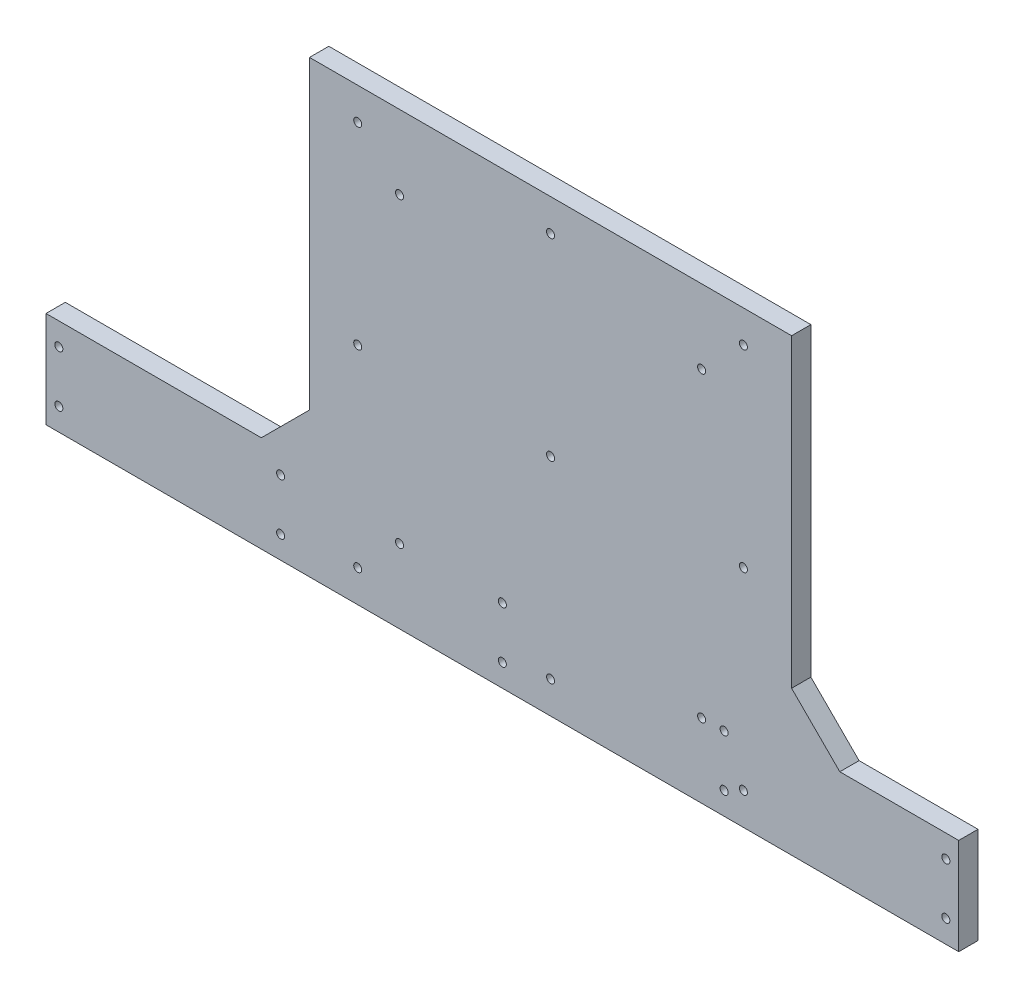
ISO-10303-21;
HEADER;
FILE_DESCRIPTION(('STEP AP214'),'2;1');
FILE_NAME('part.step','',(''),(''),'','','');
FILE_SCHEMA(('AUTOMOTIVE_DESIGN { 1 0 10303 214 1 1 1 1 }'));
ENDSEC;
DATA;
#1=APPLICATION_CONTEXT('core data for automotive mechanical design processes');
#2=APPLICATION_PROTOCOL_DEFINITION('international standard','automotive_design',2000,#1);
#3=PRODUCT_CONTEXT('',#1,'mechanical');
#4=PRODUCT('Part','Part','',(#3));
#5=PRODUCT_RELATED_PRODUCT_CATEGORY('part','',(#4));
#6=PRODUCT_DEFINITION_FORMATION('','',#4);
#7=PRODUCT_DEFINITION_CONTEXT('part definition',#1,'design');
#8=PRODUCT_DEFINITION('design','',#6,#7);
#9=PRODUCT_DEFINITION_SHAPE('','',#8);
#10=(LENGTH_UNIT() NAMED_UNIT(*) SI_UNIT(.MILLI.,.METRE.));
#11=(NAMED_UNIT(*) PLANE_ANGLE_UNIT() SI_UNIT($,.RADIAN.));
#12=(NAMED_UNIT(*) SI_UNIT($,.STERADIAN.) SOLID_ANGLE_UNIT());
#13=UNCERTAINTY_MEASURE_WITH_UNIT(LENGTH_MEASURE(1.E-05),#10,'distance_accuracy_value','');
#14=(GEOMETRIC_REPRESENTATION_CONTEXT(3) GLOBAL_UNCERTAINTY_ASSIGNED_CONTEXT((#13)) GLOBAL_UNIT_ASSIGNED_CONTEXT((#10,
#11,#12)) REPRESENTATION_CONTEXT('',''));
#15=CARTESIAN_POINT('',(0.,0.,0.));
#16=DIRECTION('',(0.,0.,1.));
#17=DIRECTION('',(1.,0.,0.));
#18=AXIS2_PLACEMENT_3D('',#15,#16,#17);
#19=CARTESIAN_POINT('',(150.,0.,6.));
#20=DIRECTION('',(-1.,0.,0.));
#21=DIRECTION('',(0.,0.,1.));
#22=AXIS2_PLACEMENT_3D('',#19,#20,#21);
#23=PLANE('',#22);
#24=DIRECTION('',(0.,1.,0.));
#25=VECTOR('',#24,1.);
#26=CARTESIAN_POINT('',(150.,0.,6.));
#27=LINE('',#26,#25);
#28=CARTESIAN_POINT('',(150.,45.,6.));
#29=VERTEX_POINT('',#28);
#30=CARTESIAN_POINT('',(150.,140.,6.));
#31=VERTEX_POINT('',#30);
#32=EDGE_CURVE('E243',#29,#31,#27,.T.);
#33=ORIENTED_EDGE('',*,*,#32,.F.);
#34=DIRECTION('',(0.,0.,-1.));
#35=VECTOR('',#34,1.);
#36=CARTESIAN_POINT('',(150.,45.,6.));
#37=LINE('',#36,#35);
#38=CARTESIAN_POINT('',(150.,45.,0.));
#39=VERTEX_POINT('',#38);
#40=EDGE_CURVE('E54',#29,#39,#37,.T.);
#41=ORIENTED_EDGE('',*,*,#40,.T.);
#42=DIRECTION('',(0.,1.,0.));
#43=VECTOR('',#42,1.);
#44=CARTESIAN_POINT('',(150.,0.,0.));
#45=LINE('',#44,#43);
#46=CARTESIAN_POINT('',(150.,140.,0.));
#47=VERTEX_POINT('',#46);
#48=EDGE_CURVE('E119',#39,#47,#45,.T.);
#49=ORIENTED_EDGE('',*,*,#48,.T.);
#50=DIRECTION('',(0.,0.,-1.));
#51=VECTOR('',#50,1.);
#52=CARTESIAN_POINT('',(150.,140.,6.));
#53=LINE('',#52,#51);
#54=EDGE_CURVE('E254',#31,#47,#53,.T.);
#55=ORIENTED_EDGE('',*,*,#54,.F.);
#56=EDGE_LOOP('',(#33,#41,#49,#55));
#57=FACE_BOUND('',#56,.T.);
#58=ADVANCED_FACE('F33',(#57),#23,.F.);
#59=CARTESIAN_POINT('',(0.,0.,6.));
#60=DIRECTION('',(1.,0.,0.));
#61=DIRECTION('',(0.,0.,-1.));
#62=AXIS2_PLACEMENT_3D('',#59,#60,#61);
#63=PLANE('',#62);
#64=DIRECTION('',(0.,-1.,0.));
#65=VECTOR('',#64,1.);
#66=CARTESIAN_POINT('',(0.,0.,0.));
#67=LINE('',#66,#65);
#68=CARTESIAN_POINT('',(0.,140.,0.));
#69=VERTEX_POINT('',#68);
#70=CARTESIAN_POINT('',(0.,45.0000000000001,0.));
#71=VERTEX_POINT('',#70);
#72=EDGE_CURVE('E120',#69,#71,#67,.T.);
#73=ORIENTED_EDGE('',*,*,#72,.T.);
#74=DIRECTION('',(0.,0.,1.));
#75=VECTOR('',#74,1.);
#76=CARTESIAN_POINT('',(0.,45.0000000000001,6.));
#77=LINE('',#76,#75);
#78=CARTESIAN_POINT('',(0.,45.0000000000001,6.));
#79=VERTEX_POINT('',#78);
#80=EDGE_CURVE('E257',#71,#79,#77,.T.);
#81=ORIENTED_EDGE('',*,*,#80,.T.);
#82=DIRECTION('',(0.,-1.,0.));
#83=VECTOR('',#82,1.);
#84=CARTESIAN_POINT('',(0.,0.,6.));
#85=LINE('',#84,#83);
#86=CARTESIAN_POINT('',(0.,140.,6.));
#87=VERTEX_POINT('',#86);
#88=EDGE_CURVE('E237',#87,#79,#85,.T.);
#89=ORIENTED_EDGE('',*,*,#88,.F.);
#90=DIRECTION('',(0.,0.,-1.));
#91=VECTOR('',#90,1.);
#92=CARTESIAN_POINT('',(0.,140.,6.));
#93=LINE('',#92,#91);
#94=EDGE_CURVE('E247',#87,#69,#93,.T.);
#95=ORIENTED_EDGE('',*,*,#94,.T.);
#96=EDGE_LOOP('',(#73,#81,#89,#95));
#97=FACE_BOUND('',#96,.T.);
#98=ADVANCED_FACE('F276',(#97),#63,.F.);
#99=CARTESIAN_POINT('',(0.,0.,6.));
#100=DIRECTION('',(0.,1.,0.));
#101=DIRECTION('',(0.,0.,1.));
#102=AXIS2_PLACEMENT_3D('',#99,#100,#101);
#103=PLANE('',#102);
#104=DIRECTION('',(1.,0.,0.));
#105=VECTOR('',#104,1.);
#106=CARTESIAN_POINT('',(0.,0.,0.));
#107=LINE('',#106,#105);
#108=CARTESIAN_POINT('',(-82.,0.,0.));
#109=VERTEX_POINT('',#108);
#110=CARTESIAN_POINT('',(202.,0.,0.));
#111=VERTEX_POINT('',#110);
#112=EDGE_CURVE('E108',#109,#111,#107,.T.);
#113=ORIENTED_EDGE('',*,*,#112,.T.);
#114=DIRECTION('',(0.,0.,1.));
#115=VECTOR('',#114,1.);
#116=CARTESIAN_POINT('',(202.,0.,0.));
#117=LINE('',#116,#115);
#118=CARTESIAN_POINT('',(202.,0.,6.));
#119=VERTEX_POINT('',#118);
#120=EDGE_CURVE('E111',#111,#119,#117,.T.);
#121=ORIENTED_EDGE('',*,*,#120,.T.);
#122=DIRECTION('',(1.,0.,0.));
#123=VECTOR('',#122,1.);
#124=CARTESIAN_POINT('',(0.,0.,6.));
#125=LINE('',#124,#123);
#126=CARTESIAN_POINT('',(-82.,0.,6.));
#127=VERTEX_POINT('',#126);
#128=EDGE_CURVE('E240',#127,#119,#125,.T.);
#129=ORIENTED_EDGE('',*,*,#128,.F.);
#130=DIRECTION('',(0.,0.,1.));
#131=VECTOR('',#130,1.);
#132=CARTESIAN_POINT('',(-82.,0.,0.));
#133=LINE('',#132,#131);
#134=EDGE_CURVE('E114',#109,#127,#133,.T.);
#135=ORIENTED_EDGE('',*,*,#134,.F.);
#136=EDGE_LOOP('',(#113,#121,#129,#135));
#137=FACE_BOUND('',#136,.T.);
#138=ADVANCED_FACE('F110',(#137),#103,.F.);
#139=CARTESIAN_POINT('',(0.,140.,6.));
#140=DIRECTION('',(0.,-1.,0.));
#141=DIRECTION('',(0.,0.,-1.));
#142=AXIS2_PLACEMENT_3D('',#139,#140,#141);
#143=PLANE('',#142);
#144=DIRECTION('',(-1.,0.,0.));
#145=VECTOR('',#144,1.);
#146=CARTESIAN_POINT('',(0.,140.,0.));
#147=LINE('',#146,#145);
#148=EDGE_CURVE('E241',#47,#69,#147,.T.);
#149=ORIENTED_EDGE('',*,*,#148,.T.);
#150=ORIENTED_EDGE('',*,*,#94,.F.);
#151=DIRECTION('',(-1.,0.,0.));
#152=VECTOR('',#151,1.);
#153=CARTESIAN_POINT('',(0.,140.,6.));
#154=LINE('',#153,#152);
#155=EDGE_CURVE('E245',#31,#87,#154,.T.);
#156=ORIENTED_EDGE('',*,*,#155,.F.);
#157=ORIENTED_EDGE('',*,*,#54,.T.);
#158=EDGE_LOOP('',(#149,#150,#156,#157));
#159=FACE_BOUND('',#158,.T.);
#160=ADVANCED_FACE('F297',(#159),#143,.F.);
#161=CARTESIAN_POINT('',(0.,0.,6.));
#162=DIRECTION('',(0.,0.,-1.));
#163=DIRECTION('',(-1.,0.,0.));
#164=AXIS2_PLACEMENT_3D('',#161,#162,#163);
#165=PLANE('',#164);
#166=CARTESIAN_POINT('',(60.,23.,6.));
#167=DIRECTION('',(0.,0.,1.));
#168=DIRECTION('',(-1.,0.,0.));
#169=AXIS2_PLACEMENT_3D('',#166,#167,#168);
#170=CIRCLE('',#169,1.25000000000002);
#171=CARTESIAN_POINT('',(58.75,23.,6.));
#172=VERTEX_POINT('',#171);
#173=EDGE_CURVE('E543',#172,#172,#170,.T.);
#174=ORIENTED_EDGE('',*,*,#173,.F.);
#175=EDGE_LOOP('',(#174));
#176=FACE_BOUND('',#175,.T.);
#177=CARTESIAN_POINT('',(-9.00000000000002,23.,6.));
#178=DIRECTION('',(0.,0.,1.));
#179=DIRECTION('',(1.,0.,0.));
#180=AXIS2_PLACEMENT_3D('',#177,#178,#179);
#181=CIRCLE('',#180,1.25000000000002);
#182=CARTESIAN_POINT('',(-7.75,23.,6.));
#183=VERTEX_POINT('',#182);
#184=EDGE_CURVE('E539',#183,#183,#181,.T.);
#185=ORIENTED_EDGE('',*,*,#184,.F.);
#186=EDGE_LOOP('',(#185));
#187=FACE_BOUND('',#186,.T.);
#188=CARTESIAN_POINT('',(-9.00000000000002,7.,6.));
#189=DIRECTION('',(0.,0.,1.));
#190=DIRECTION('',(-1.,0.,0.));
#191=AXIS2_PLACEMENT_3D('',#188,#189,#190);
#192=CIRCLE('',#191,1.24999999999998);
#193=CARTESIAN_POINT('',(-10.25,7.,6.));
#194=VERTEX_POINT('',#193);
#195=EDGE_CURVE('E555',#194,#194,#192,.T.);
#196=ORIENTED_EDGE('',*,*,#195,.F.);
#197=EDGE_LOOP('',(#196));
#198=FACE_BOUND('',#197,.T.);
#199=CARTESIAN_POINT('',(129.,7.00000000000002,6.));
#200=DIRECTION('',(0.,0.,1.));
#201=DIRECTION('',(1.,0.,0.));
#202=AXIS2_PLACEMENT_3D('',#199,#200,#201);
#203=CIRCLE('',#202,1.25000000000001);
#204=CARTESIAN_POINT('',(130.25,7.00000000000002,6.));
#205=VERTEX_POINT('',#204);
#206=EDGE_CURVE('E551',#205,#205,#203,.T.);
#207=ORIENTED_EDGE('',*,*,#206,.F.);
#208=EDGE_LOOP('',(#207));
#209=FACE_BOUND('',#208,.T.);
#210=CARTESIAN_POINT('',(129.,23.,6.));
#211=DIRECTION('',(0.,0.,1.));
#212=DIRECTION('',(-1.,0.,0.));
#213=AXIS2_PLACEMENT_3D('',#210,#211,#212);
#214=CIRCLE('',#213,1.25000000000004);
#215=CARTESIAN_POINT('',(127.75,23.,6.));
#216=VERTEX_POINT('',#215);
#217=EDGE_CURVE('E547',#216,#216,#214,.T.);
#218=ORIENTED_EDGE('',*,*,#217,.F.);
#219=EDGE_LOOP('',(#218));
#220=FACE_BOUND('',#219,.T.);
#221=CARTESIAN_POINT('',(-78.,6.99999999999999,6.));
#222=DIRECTION('',(0.,0.,1.));
#223=DIRECTION('',(-1.,0.,0.));
#224=AXIS2_PLACEMENT_3D('',#221,#222,#223);
#225=CIRCLE('',#224,1.24999999999998);
#226=CARTESIAN_POINT('',(-79.25,6.99999999999999,6.));
#227=VERTEX_POINT('',#226);
#228=EDGE_CURVE('E527',#227,#227,#225,.T.);
#229=ORIENTED_EDGE('',*,*,#228,.F.);
#230=EDGE_LOOP('',(#229));
#231=FACE_BOUND('',#230,.T.);
#232=CARTESIAN_POINT('',(198.,6.99999999999999,6.));
#233=DIRECTION('',(0.,0.,1.));
#234=DIRECTION('',(1.,0.,0.));
#235=AXIS2_PLACEMENT_3D('',#232,#233,#234);
#236=CIRCLE('',#235,1.24999999999996);
#237=CARTESIAN_POINT('',(199.25,6.99999999999999,6.));
#238=VERTEX_POINT('',#237);
#239=EDGE_CURVE('E523',#238,#238,#236,.T.);
#240=ORIENTED_EDGE('',*,*,#239,.F.);
#241=EDGE_LOOP('',(#240));
#242=FACE_BOUND('',#241,.T.);
#243=CARTESIAN_POINT('',(198.,23.,6.));
#244=DIRECTION('',(0.,0.,1.));
#245=DIRECTION('',(-1.,0.,0.));
#246=AXIS2_PLACEMENT_3D('',#243,#244,#245);
#247=CIRCLE('',#246,1.24999999999996);
#248=CARTESIAN_POINT('',(196.75,23.,6.));
#249=VERTEX_POINT('',#248);
#250=EDGE_CURVE('E535',#249,#249,#247,.T.);
#251=ORIENTED_EDGE('',*,*,#250,.F.);
#252=EDGE_LOOP('',(#251));
#253=FACE_BOUND('',#252,.T.);
#254=CARTESIAN_POINT('',(60.,7.,6.));
#255=DIRECTION('',(0.,0.,1.));
#256=DIRECTION('',(1.,0.,0.));
#257=AXIS2_PLACEMENT_3D('',#254,#255,#256);
#258=CIRCLE('',#257,1.24999999999998);
#259=CARTESIAN_POINT('',(61.25,7.,6.));
#260=VERTEX_POINT('',#259);
#261=EDGE_CURVE('E531',#260,#260,#258,.T.);
#262=ORIENTED_EDGE('',*,*,#261,.F.);
#263=EDGE_LOOP('',(#262));
#264=FACE_BOUND('',#263,.T.);
#265=CARTESIAN_POINT('',(-78.,23.,6.));
#266=DIRECTION('',(0.,0.,1.));
#267=DIRECTION('',(1.,0.,0.));
#268=AXIS2_PLACEMENT_3D('',#265,#266,#267);
#269=CIRCLE('',#268,1.25);
#270=CARTESIAN_POINT('',(-76.75,23.,6.));
#271=VERTEX_POINT('',#270);
#272=EDGE_CURVE('E140',#271,#271,#269,.T.);
#273=ORIENTED_EDGE('',*,*,#272,.F.);
#274=EDGE_LOOP('',(#273));
#275=FACE_BOUND('',#274,.T.);
#276=CARTESIAN_POINT('',(75.,70.,6.));
#277=DIRECTION('',(0.,0.,1.));
#278=DIRECTION('',(-1.,0.,0.));
#279=AXIS2_PLACEMENT_3D('',#276,#277,#278);
#280=CIRCLE('',#279,1.25);
#281=CARTESIAN_POINT('',(73.75,70.,6.));
#282=VERTEX_POINT('',#281);
#283=EDGE_CURVE('E176',#282,#282,#280,.T.);
#284=ORIENTED_EDGE('',*,*,#283,.F.);
#285=EDGE_LOOP('',(#284));
#286=FACE_BOUND('',#285,.T.);
#287=CARTESIAN_POINT('',(135.,130.,6.));
#288=DIRECTION('',(0.,0.,1.));
#289=DIRECTION('',(1.,0.,0.));
#290=AXIS2_PLACEMENT_3D('',#287,#288,#289);
#291=CIRCLE('',#290,1.25000000000001);
#292=CARTESIAN_POINT('',(136.25,130.,6.));
#293=VERTEX_POINT('',#292);
#294=EDGE_CURVE('E163',#293,#293,#291,.T.);
#295=ORIENTED_EDGE('',*,*,#294,.F.);
#296=EDGE_LOOP('',(#295));
#297=FACE_BOUND('',#296,.T.);
#298=CARTESIAN_POINT('',(15.,130.,6.));
#299=DIRECTION('',(0.,0.,1.));
#300=DIRECTION('',(-1.,0.,0.));
#301=AXIS2_PLACEMENT_3D('',#298,#299,#300);
#302=CIRCLE('',#301,1.25);
#303=CARTESIAN_POINT('',(13.75,130.,6.));
#304=VERTEX_POINT('',#303);
#305=EDGE_CURVE('E164',#304,#304,#302,.T.);
#306=ORIENTED_EDGE('',*,*,#305,.F.);
#307=EDGE_LOOP('',(#306));
#308=FACE_BOUND('',#307,.T.);
#309=CARTESIAN_POINT('',(75.,130.,6.));
#310=DIRECTION('',(0.,0.,1.));
#311=DIRECTION('',(-1.,0.,0.));
#312=AXIS2_PLACEMENT_3D('',#309,#310,#311);
#313=CIRCLE('',#312,1.25);
#314=CARTESIAN_POINT('',(73.75,130.,6.));
#315=VERTEX_POINT('',#314);
#316=EDGE_CURVE('E157',#315,#315,#313,.T.);
#317=ORIENTED_EDGE('',*,*,#316,.F.);
#318=EDGE_LOOP('',(#317));
#319=FACE_BOUND('',#318,.T.);
#320=CARTESIAN_POINT('',(15.,70.,6.));
#321=DIRECTION('',(0.,0.,1.));
#322=DIRECTION('',(-1.,0.,0.));
#323=AXIS2_PLACEMENT_3D('',#320,#321,#322);
#324=CIRCLE('',#323,1.25);
#325=CARTESIAN_POINT('',(13.75,70.,6.));
#326=VERTEX_POINT('',#325);
#327=EDGE_CURVE('E175',#326,#326,#324,.T.);
#328=ORIENTED_EDGE('',*,*,#327,.F.);
#329=EDGE_LOOP('',(#328));
#330=FACE_BOUND('',#329,.T.);
#331=CARTESIAN_POINT('',(135.,70.,6.));
#332=DIRECTION('',(0.,0.,1.));
#333=DIRECTION('',(1.,0.,0.));
#334=AXIS2_PLACEMENT_3D('',#331,#332,#333);
#335=CIRCLE('',#334,1.25000000000001);
#336=CARTESIAN_POINT('',(136.25,70.,6.));
#337=VERTEX_POINT('',#336);
#338=EDGE_CURVE('E200',#337,#337,#335,.T.);
#339=ORIENTED_EDGE('',*,*,#338,.F.);
#340=EDGE_LOOP('',(#339));
#341=FACE_BOUND('',#340,.T.);
#342=CARTESIAN_POINT('',(135.,10.,6.));
#343=DIRECTION('',(0.,0.,1.));
#344=DIRECTION('',(-1.,0.,0.));
#345=AXIS2_PLACEMENT_3D('',#342,#343,#344);
#346=CIRCLE('',#345,1.25000000000001);
#347=CARTESIAN_POINT('',(133.75,10.,6.));
#348=VERTEX_POINT('',#347);
#349=EDGE_CURVE('E194',#348,#348,#346,.T.);
#350=ORIENTED_EDGE('',*,*,#349,.F.);
#351=EDGE_LOOP('',(#350));
#352=FACE_BOUND('',#351,.T.);
#353=CARTESIAN_POINT('',(15.,10.,6.));
#354=DIRECTION('',(0.,0.,1.));
#355=DIRECTION('',(1.,0.,0.));
#356=AXIS2_PLACEMENT_3D('',#353,#354,#355);
#357=CIRCLE('',#356,1.25);
#358=CARTESIAN_POINT('',(16.25,10.,6.));
#359=VERTEX_POINT('',#358);
#360=EDGE_CURVE('E188',#359,#359,#357,.T.);
#361=ORIENTED_EDGE('',*,*,#360,.F.);
#362=EDGE_LOOP('',(#361));
#363=FACE_BOUND('',#362,.T.);
#364=CARTESIAN_POINT('',(75.,10.,6.));
#365=DIRECTION('',(0.,0.,1.));
#366=DIRECTION('',(1.,0.,0.));
#367=AXIS2_PLACEMENT_3D('',#364,#365,#366);
#368=CIRCLE('',#367,1.25);
#369=CARTESIAN_POINT('',(76.25,10.,6.));
#370=VERTEX_POINT('',#369);
#371=EDGE_CURVE('E187',#370,#370,#368,.T.);
#372=ORIENTED_EDGE('',*,*,#371,.F.);
#373=EDGE_LOOP('',(#372));
#374=FACE_BOUND('',#373,.T.);
#375=CARTESIAN_POINT('',(122.,117.,6.));
#376=DIRECTION('',(0.,0.,1.));
#377=DIRECTION('',(-1.,0.,0.));
#378=AXIS2_PLACEMENT_3D('',#375,#376,#377);
#379=CIRCLE('',#378,1.25);
#380=CARTESIAN_POINT('',(120.75,117.,6.));
#381=VERTEX_POINT('',#380);
#382=EDGE_CURVE('E218',#381,#381,#379,.T.);
#383=ORIENTED_EDGE('',*,*,#382,.F.);
#384=EDGE_LOOP('',(#383));
#385=FACE_BOUND('',#384,.T.);
#386=CARTESIAN_POINT('',(122.,23.,6.));
#387=DIRECTION('',(0.,0.,1.));
#388=DIRECTION('',(1.,0.,0.));
#389=AXIS2_PLACEMENT_3D('',#386,#387,#388);
#390=CIRCLE('',#389,1.25);
#391=CARTESIAN_POINT('',(123.25,23.,6.));
#392=VERTEX_POINT('',#391);
#393=EDGE_CURVE('E224',#392,#392,#390,.T.);
#394=ORIENTED_EDGE('',*,*,#393,.F.);
#395=EDGE_LOOP('',(#394));
#396=FACE_BOUND('',#395,.T.);
#397=CARTESIAN_POINT('',(28.,23.,6.));
#398=DIRECTION('',(0.,0.,1.));
#399=DIRECTION('',(-1.,0.,0.));
#400=AXIS2_PLACEMENT_3D('',#397,#398,#399);
#401=CIRCLE('',#400,1.25);
#402=CARTESIAN_POINT('',(26.75,23.,6.));
#403=VERTEX_POINT('',#402);
#404=EDGE_CURVE('E211',#403,#403,#401,.T.);
#405=ORIENTED_EDGE('',*,*,#404,.F.);
#406=EDGE_LOOP('',(#405));
#407=FACE_BOUND('',#406,.T.);
#408=CARTESIAN_POINT('',(28.,117.,6.));
#409=DIRECTION('',(0.,0.,1.));
#410=DIRECTION('',(1.,0.,0.));
#411=AXIS2_PLACEMENT_3D('',#408,#409,#410);
#412=CIRCLE('',#411,1.25);
#413=CARTESIAN_POINT('',(29.25,117.,6.));
#414=VERTEX_POINT('',#413);
#415=EDGE_CURVE('E217',#414,#414,#412,.T.);
#416=ORIENTED_EDGE('',*,*,#415,.F.);
#417=EDGE_LOOP('',(#416));
#418=FACE_BOUND('',#417,.T.);
#419=ORIENTED_EDGE('',*,*,#88,.T.);
#420=DIRECTION('',(-0.707106781186544,-0.707106781186551,0.));
#421=VECTOR('',#420,1.);
#422=CARTESIAN_POINT('',(-22.5,22.4999999999998,6.));
#423=LINE('',#422,#421);
#424=CARTESIAN_POINT('',(-15.,30.,6.));
#425=VERTEX_POINT('',#424);
#426=EDGE_CURVE('E266',#79,#425,#423,.T.);
#427=ORIENTED_EDGE('',*,*,#426,.T.);
#428=DIRECTION('',(-1.,0.,0.));
#429=VECTOR('',#428,1.);
#430=CARTESIAN_POINT('',(0.,30.,6.));
#431=LINE('',#430,#429);
#432=CARTESIAN_POINT('',(-82.,30.,6.));
#433=VERTEX_POINT('',#432);
#434=EDGE_CURVE('E145',#425,#433,#431,.T.);
#435=ORIENTED_EDGE('',*,*,#434,.T.);
#436=DIRECTION('',(0.,-1.,0.));
#437=VECTOR('',#436,1.);
#438=CARTESIAN_POINT('',(-82.,0.,6.));
#439=LINE('',#438,#437);
#440=EDGE_CURVE('E150',#433,#127,#439,.T.);
#441=ORIENTED_EDGE('',*,*,#440,.T.);
#442=ORIENTED_EDGE('',*,*,#128,.T.);
#443=DIRECTION('',(0.,1.,0.));
#444=VECTOR('',#443,1.);
#445=CARTESIAN_POINT('',(202.,0.,6.));
#446=LINE('',#445,#444);
#447=CARTESIAN_POINT('',(202.,30.,6.));
#448=VERTEX_POINT('',#447);
#449=EDGE_CURVE('E128',#119,#448,#446,.T.);
#450=ORIENTED_EDGE('',*,*,#449,.T.);
#451=DIRECTION('',(-1.,0.,0.));
#452=VECTOR('',#451,1.);
#453=CARTESIAN_POINT('',(150.,30.,6.));
#454=LINE('',#453,#452);
#455=CARTESIAN_POINT('',(165.,30.,6.));
#456=VERTEX_POINT('',#455);
#457=EDGE_CURVE('E135',#448,#456,#454,.T.);
#458=ORIENTED_EDGE('',*,*,#457,.T.);
#459=DIRECTION('',(-0.707106781186551,0.707106781186544,0.));
#460=VECTOR('',#459,1.);
#461=CARTESIAN_POINT('',(97.4999999999993,97.5000000000002,6.));
#462=LINE('',#461,#460);
#463=EDGE_CURVE('E41',#456,#29,#462,.T.);
#464=ORIENTED_EDGE('',*,*,#463,.T.);
#465=ORIENTED_EDGE('',*,*,#32,.T.);
#466=ORIENTED_EDGE('',*,*,#155,.T.);
#467=EDGE_LOOP('',(#419,#427,#435,#441,#442,#450,#458,#464,#465,#466));
#468=FACE_BOUND('',#467,.T.);
#469=ADVANCED_FACE('F281',(#176,#187,#198,#209,#220,#231,#242,#253,#264,#275,#286,#297,#308,
#319,#330,#341,#352,#363,#374,#385,#396,#407,#418,#468),#165,.F.);
#470=CARTESIAN_POINT('',(0.,0.,0.));
#471=DIRECTION('',(0.,0.,-1.));
#472=DIRECTION('',(-1.,0.,0.));
#473=AXIS2_PLACEMENT_3D('',#470,#471,#472);
#474=PLANE('',#473);
#475=CARTESIAN_POINT('',(60.,23.,0.));
#476=DIRECTION('',(0.,0.,1.));
#477=DIRECTION('',(-1.,0.,0.));
#478=AXIS2_PLACEMENT_3D('',#475,#476,#477);
#479=CIRCLE('',#478,1.25000000000002);
#480=CARTESIAN_POINT('',(58.75,23.,0.));
#481=VERTEX_POINT('',#480);
#482=EDGE_CURVE('E421',#481,#481,#479,.T.);
#483=ORIENTED_EDGE('',*,*,#482,.T.);
#484=EDGE_LOOP('',(#483));
#485=FACE_BOUND('',#484,.T.);
#486=CARTESIAN_POINT('',(-9.00000000000002,23.,0.));
#487=DIRECTION('',(0.,0.,1.));
#488=DIRECTION('',(1.,0.,0.));
#489=AXIS2_PLACEMENT_3D('',#486,#487,#488);
#490=CIRCLE('',#489,1.25000000000002);
#491=CARTESIAN_POINT('',(-7.75,23.,0.));
#492=VERTEX_POINT('',#491);
#493=EDGE_CURVE('E425',#492,#492,#490,.T.);
#494=ORIENTED_EDGE('',*,*,#493,.T.);
#495=EDGE_LOOP('',(#494));
#496=FACE_BOUND('',#495,.T.);
#497=CARTESIAN_POINT('',(-9.00000000000002,7.,0.));
#498=DIRECTION('',(0.,0.,1.));
#499=DIRECTION('',(-1.,0.,0.));
#500=AXIS2_PLACEMENT_3D('',#497,#498,#499);
#501=CIRCLE('',#500,1.24999999999998);
#502=CARTESIAN_POINT('',(-10.25,7.,0.));
#503=VERTEX_POINT('',#502);
#504=EDGE_CURVE('E429',#503,#503,#501,.T.);
#505=ORIENTED_EDGE('',*,*,#504,.T.);
#506=EDGE_LOOP('',(#505));
#507=FACE_BOUND('',#506,.T.);
#508=CARTESIAN_POINT('',(129.,7.00000000000002,0.));
#509=DIRECTION('',(0.,0.,1.));
#510=DIRECTION('',(1.,0.,0.));
#511=AXIS2_PLACEMENT_3D('',#508,#509,#510);
#512=CIRCLE('',#511,1.25000000000001);
#513=CARTESIAN_POINT('',(130.25,7.00000000000002,0.));
#514=VERTEX_POINT('',#513);
#515=EDGE_CURVE('E433',#514,#514,#512,.T.);
#516=ORIENTED_EDGE('',*,*,#515,.T.);
#517=EDGE_LOOP('',(#516));
#518=FACE_BOUND('',#517,.T.);
#519=CARTESIAN_POINT('',(129.,23.,0.));
#520=DIRECTION('',(0.,0.,1.));
#521=DIRECTION('',(-1.,0.,0.));
#522=AXIS2_PLACEMENT_3D('',#519,#520,#521);
#523=CIRCLE('',#522,1.25000000000004);
#524=CARTESIAN_POINT('',(127.75,23.,0.));
#525=VERTEX_POINT('',#524);
#526=EDGE_CURVE('E437',#525,#525,#523,.T.);
#527=ORIENTED_EDGE('',*,*,#526,.T.);
#528=EDGE_LOOP('',(#527));
#529=FACE_BOUND('',#528,.T.);
#530=CARTESIAN_POINT('',(-78.,6.99999999999999,0.));
#531=DIRECTION('',(0.,0.,1.));
#532=DIRECTION('',(-1.,0.,0.));
#533=AXIS2_PLACEMENT_3D('',#530,#531,#532);
#534=CIRCLE('',#533,1.24999999999998);
#535=CARTESIAN_POINT('',(-79.25,6.99999999999999,0.));
#536=VERTEX_POINT('',#535);
#537=EDGE_CURVE('E441',#536,#536,#534,.T.);
#538=ORIENTED_EDGE('',*,*,#537,.T.);
#539=EDGE_LOOP('',(#538));
#540=FACE_BOUND('',#539,.T.);
#541=CARTESIAN_POINT('',(198.,6.99999999999999,0.));
#542=DIRECTION('',(0.,0.,1.));
#543=DIRECTION('',(1.,0.,0.));
#544=AXIS2_PLACEMENT_3D('',#541,#542,#543);
#545=CIRCLE('',#544,1.24999999999996);
#546=CARTESIAN_POINT('',(199.25,6.99999999999999,0.));
#547=VERTEX_POINT('',#546);
#548=EDGE_CURVE('E445',#547,#547,#545,.T.);
#549=ORIENTED_EDGE('',*,*,#548,.T.);
#550=EDGE_LOOP('',(#549));
#551=FACE_BOUND('',#550,.T.);
#552=CARTESIAN_POINT('',(198.,23.,0.));
#553=DIRECTION('',(0.,0.,1.));
#554=DIRECTION('',(-1.,0.,0.));
#555=AXIS2_PLACEMENT_3D('',#552,#553,#554);
#556=CIRCLE('',#555,1.24999999999996);
#557=CARTESIAN_POINT('',(196.75,23.,0.));
#558=VERTEX_POINT('',#557);
#559=EDGE_CURVE('E449',#558,#558,#556,.T.);
#560=ORIENTED_EDGE('',*,*,#559,.T.);
#561=EDGE_LOOP('',(#560));
#562=FACE_BOUND('',#561,.T.);
#563=CARTESIAN_POINT('',(60.,7.,0.));
#564=DIRECTION('',(0.,0.,1.));
#565=DIRECTION('',(1.,0.,0.));
#566=AXIS2_PLACEMENT_3D('',#563,#564,#565);
#567=CIRCLE('',#566,1.24999999999998);
#568=CARTESIAN_POINT('',(61.25,7.,0.));
#569=VERTEX_POINT('',#568);
#570=EDGE_CURVE('E453',#569,#569,#567,.T.);
#571=ORIENTED_EDGE('',*,*,#570,.T.);
#572=EDGE_LOOP('',(#571));
#573=FACE_BOUND('',#572,.T.);
#574=CARTESIAN_POINT('',(-78.,23.,0.));
#575=DIRECTION('',(0.,0.,1.));
#576=DIRECTION('',(1.,0.,0.));
#577=AXIS2_PLACEMENT_3D('',#574,#575,#576);
#578=CIRCLE('',#577,1.25);
#579=CARTESIAN_POINT('',(-76.75,23.,0.));
#580=VERTEX_POINT('',#579);
#581=EDGE_CURVE('E143',#580,#580,#578,.T.);
#582=ORIENTED_EDGE('',*,*,#581,.T.);
#583=EDGE_LOOP('',(#582));
#584=FACE_BOUND('',#583,.T.);
#585=CARTESIAN_POINT('',(75.,70.,0.));
#586=DIRECTION('',(0.,0.,1.));
#587=DIRECTION('',(-1.,0.,0.));
#588=AXIS2_PLACEMENT_3D('',#585,#586,#587);
#589=CIRCLE('',#588,1.25);
#590=CARTESIAN_POINT('',(73.75,70.,0.));
#591=VERTEX_POINT('',#590);
#592=EDGE_CURVE('E172',#591,#591,#589,.T.);
#593=ORIENTED_EDGE('',*,*,#592,.T.);
#594=EDGE_LOOP('',(#593));
#595=FACE_BOUND('',#594,.T.);
#596=CARTESIAN_POINT('',(135.,130.,0.));
#597=DIRECTION('',(0.,0.,1.));
#598=DIRECTION('',(1.,0.,0.));
#599=AXIS2_PLACEMENT_3D('',#596,#597,#598);
#600=CIRCLE('',#599,1.25000000000001);
#601=CARTESIAN_POINT('',(136.25,130.,0.));
#602=VERTEX_POINT('',#601);
#603=EDGE_CURVE('E179',#602,#602,#600,.T.);
#604=ORIENTED_EDGE('',*,*,#603,.T.);
#605=EDGE_LOOP('',(#604));
#606=FACE_BOUND('',#605,.T.);
#607=CARTESIAN_POINT('',(15.,130.,0.));
#608=DIRECTION('',(0.,0.,1.));
#609=DIRECTION('',(-1.,0.,0.));
#610=AXIS2_PLACEMENT_3D('',#607,#608,#609);
#611=CIRCLE('',#610,1.25);
#612=CARTESIAN_POINT('',(13.75,130.,0.));
#613=VERTEX_POINT('',#612);
#614=EDGE_CURVE('E160',#613,#613,#611,.T.);
#615=ORIENTED_EDGE('',*,*,#614,.T.);
#616=EDGE_LOOP('',(#615));
#617=FACE_BOUND('',#616,.T.);
#618=CARTESIAN_POINT('',(75.,130.,0.));
#619=DIRECTION('',(0.,0.,1.));
#620=DIRECTION('',(-1.,0.,0.));
#621=AXIS2_PLACEMENT_3D('',#618,#619,#620);
#622=CIRCLE('',#621,1.25);
#623=CARTESIAN_POINT('',(73.75,130.,0.));
#624=VERTEX_POINT('',#623);
#625=EDGE_CURVE('E167',#624,#624,#622,.T.);
#626=ORIENTED_EDGE('',*,*,#625,.T.);
#627=EDGE_LOOP('',(#626));
#628=FACE_BOUND('',#627,.T.);
#629=CARTESIAN_POINT('',(15.,70.,0.));
#630=DIRECTION('',(0.,0.,1.));
#631=DIRECTION('',(-1.,0.,0.));
#632=AXIS2_PLACEMENT_3D('',#629,#630,#631);
#633=CIRCLE('',#632,1.25);
#634=CARTESIAN_POINT('',(13.75,70.,0.));
#635=VERTEX_POINT('',#634);
#636=EDGE_CURVE('E203',#635,#635,#633,.T.);
#637=ORIENTED_EDGE('',*,*,#636,.T.);
#638=EDGE_LOOP('',(#637));
#639=FACE_BOUND('',#638,.T.);
#640=CARTESIAN_POINT('',(135.,70.,0.));
#641=DIRECTION('',(0.,0.,1.));
#642=DIRECTION('',(1.,0.,0.));
#643=AXIS2_PLACEMENT_3D('',#640,#641,#642);
#644=CIRCLE('',#643,1.25000000000001);
#645=CARTESIAN_POINT('',(136.25,70.,0.));
#646=VERTEX_POINT('',#645);
#647=EDGE_CURVE('E197',#646,#646,#644,.T.);
#648=ORIENTED_EDGE('',*,*,#647,.T.);
#649=EDGE_LOOP('',(#648));
#650=FACE_BOUND('',#649,.T.);
#651=CARTESIAN_POINT('',(135.,10.,0.));
#652=DIRECTION('',(0.,0.,1.));
#653=DIRECTION('',(-1.,0.,0.));
#654=AXIS2_PLACEMENT_3D('',#651,#652,#653);
#655=CIRCLE('',#654,1.25000000000001);
#656=CARTESIAN_POINT('',(133.75,10.,0.));
#657=VERTEX_POINT('',#656);
#658=EDGE_CURVE('E191',#657,#657,#655,.T.);
#659=ORIENTED_EDGE('',*,*,#658,.T.);
#660=EDGE_LOOP('',(#659));
#661=FACE_BOUND('',#660,.T.);
#662=CARTESIAN_POINT('',(15.,10.,0.));
#663=DIRECTION('',(0.,0.,1.));
#664=DIRECTION('',(1.,0.,0.));
#665=AXIS2_PLACEMENT_3D('',#662,#663,#664);
#666=CIRCLE('',#665,1.25);
#667=CARTESIAN_POINT('',(16.25,10.,0.));
#668=VERTEX_POINT('',#667);
#669=EDGE_CURVE('E184',#668,#668,#666,.T.);
#670=ORIENTED_EDGE('',*,*,#669,.T.);
#671=EDGE_LOOP('',(#670));
#672=FACE_BOUND('',#671,.T.);
#673=CARTESIAN_POINT('',(75.,10.,0.));
#674=DIRECTION('',(0.,0.,1.));
#675=DIRECTION('',(1.,0.,0.));
#676=AXIS2_PLACEMENT_3D('',#673,#674,#675);
#677=CIRCLE('',#676,1.25);
#678=CARTESIAN_POINT('',(76.25,10.,0.));
#679=VERTEX_POINT('',#678);
#680=EDGE_CURVE('E208',#679,#679,#677,.T.);
#681=ORIENTED_EDGE('',*,*,#680,.T.);
#682=EDGE_LOOP('',(#681));
#683=FACE_BOUND('',#682,.T.);
#684=CARTESIAN_POINT('',(122.,117.,0.));
#685=DIRECTION('',(0.,0.,1.));
#686=DIRECTION('',(-1.,0.,0.));
#687=AXIS2_PLACEMENT_3D('',#684,#685,#686);
#688=CIRCLE('',#687,1.25);
#689=CARTESIAN_POINT('',(120.75,117.,0.));
#690=VERTEX_POINT('',#689);
#691=EDGE_CURVE('E214',#690,#690,#688,.T.);
#692=ORIENTED_EDGE('',*,*,#691,.T.);
#693=EDGE_LOOP('',(#692));
#694=FACE_BOUND('',#693,.T.);
#695=CARTESIAN_POINT('',(122.,23.,0.));
#696=DIRECTION('',(0.,0.,1.));
#697=DIRECTION('',(1.,0.,0.));
#698=AXIS2_PLACEMENT_3D('',#695,#696,#697);
#699=CIRCLE('',#698,1.25);
#700=CARTESIAN_POINT('',(123.25,23.,0.));
#701=VERTEX_POINT('',#700);
#702=EDGE_CURVE('E221',#701,#701,#699,.T.);
#703=ORIENTED_EDGE('',*,*,#702,.T.);
#704=EDGE_LOOP('',(#703));
#705=FACE_BOUND('',#704,.T.);
#706=CARTESIAN_POINT('',(28.,23.,0.));
#707=DIRECTION('',(0.,0.,1.));
#708=DIRECTION('',(-1.,0.,0.));
#709=AXIS2_PLACEMENT_3D('',#706,#707,#708);
#710=CIRCLE('',#709,1.25);
#711=CARTESIAN_POINT('',(26.75,23.,0.));
#712=VERTEX_POINT('',#711);
#713=EDGE_CURVE('E227',#712,#712,#710,.T.);
#714=ORIENTED_EDGE('',*,*,#713,.T.);
#715=EDGE_LOOP('',(#714));
#716=FACE_BOUND('',#715,.T.);
#717=CARTESIAN_POINT('',(28.,117.,0.));
#718=DIRECTION('',(0.,0.,1.));
#719=DIRECTION('',(1.,0.,0.));
#720=AXIS2_PLACEMENT_3D('',#717,#718,#719);
#721=CIRCLE('',#720,1.25);
#722=CARTESIAN_POINT('',(29.25,117.,0.));
#723=VERTEX_POINT('',#722);
#724=EDGE_CURVE('E232',#723,#723,#721,.T.);
#725=ORIENTED_EDGE('',*,*,#724,.T.);
#726=EDGE_LOOP('',(#725));
#727=FACE_BOUND('',#726,.T.);
#728=ORIENTED_EDGE('',*,*,#72,.F.);
#729=ORIENTED_EDGE('',*,*,#148,.F.);
#730=ORIENTED_EDGE('',*,*,#48,.F.);
#731=DIRECTION('',(0.707106781186551,-0.707106781186544,0.));
#732=VECTOR('',#731,1.);
#733=CARTESIAN_POINT('',(165.,30.,0.));
#734=LINE('',#733,#732);
#735=CARTESIAN_POINT('',(165.,30.,0.));
#736=VERTEX_POINT('',#735);
#737=EDGE_CURVE('E11',#39,#736,#734,.T.);
#738=ORIENTED_EDGE('',*,*,#737,.T.);
#739=DIRECTION('',(-1.,0.,0.));
#740=VECTOR('',#739,1.);
#741=CARTESIAN_POINT('',(150.,30.,0.));
#742=LINE('',#741,#740);
#743=CARTESIAN_POINT('',(202.,30.,0.));
#744=VERTEX_POINT('',#743);
#745=EDGE_CURVE('E130',#744,#736,#742,.T.);
#746=ORIENTED_EDGE('',*,*,#745,.F.);
#747=DIRECTION('',(0.,1.,0.));
#748=VECTOR('',#747,1.);
#749=CARTESIAN_POINT('',(202.,0.,0.));
#750=LINE('',#749,#748);
#751=EDGE_CURVE('E125',#111,#744,#750,.T.);
#752=ORIENTED_EDGE('',*,*,#751,.F.);
#753=ORIENTED_EDGE('',*,*,#112,.F.);
#754=DIRECTION('',(0.,-1.,0.));
#755=VECTOR('',#754,1.);
#756=CARTESIAN_POINT('',(-82.,0.,0.));
#757=LINE('',#756,#755);
#758=CARTESIAN_POINT('',(-82.,30.,0.));
#759=VERTEX_POINT('',#758);
#760=EDGE_CURVE('E149',#759,#109,#757,.T.);
#761=ORIENTED_EDGE('',*,*,#760,.F.);
#762=DIRECTION('',(-1.,0.,0.));
#763=VECTOR('',#762,1.);
#764=CARTESIAN_POINT('',(0.,30.,0.));
#765=LINE('',#764,#763);
#766=CARTESIAN_POINT('',(-15.,30.,0.));
#767=VERTEX_POINT('',#766);
#768=EDGE_CURVE('E147',#767,#759,#765,.T.);
#769=ORIENTED_EDGE('',*,*,#768,.F.);
#770=DIRECTION('',(0.707106781186544,0.707106781186551,0.));
#771=VECTOR('',#770,1.);
#772=CARTESIAN_POINT('',(0.,45.0000000000001,0.));
#773=LINE('',#772,#771);
#774=EDGE_CURVE('E268',#767,#71,#773,.T.);
#775=ORIENTED_EDGE('',*,*,#774,.T.);
#776=EDGE_LOOP('',(#728,#729,#730,#738,#746,#752,#753,#761,#769,#775));
#777=FACE_BOUND('',#776,.T.);
#778=ADVANCED_FACE('F133',(#485,#496,#507,#518,#529,#540,#551,#562,#573,#584,#595,#606,#617,
#628,#639,#650,#661,#672,#683,#694,#705,#716,#727,#777),#474,.T.);
#779=CARTESIAN_POINT('',(28.,117.,0.));
#780=DIRECTION('',(0.,0.,1.));
#781=DIRECTION('',(1.,0.,0.));
#782=AXIS2_PLACEMENT_3D('',#779,#780,#781);
#783=CYLINDRICAL_SURFACE('',#782,1.25);
#784=ORIENTED_EDGE('',*,*,#724,.F.);
#785=EDGE_LOOP('',(#784));
#786=FACE_BOUND('',#785,.T.);
#787=ORIENTED_EDGE('',*,*,#415,.T.);
#788=EDGE_LOOP('',(#787));
#789=FACE_BOUND('',#788,.T.);
#790=ADVANCED_FACE('F412',(#786,#789),#783,.F.);
#791=CARTESIAN_POINT('',(28.,23.,0.));
#792=DIRECTION('',(0.,0.,1.));
#793=DIRECTION('',(1.,0.,0.));
#794=AXIS2_PLACEMENT_3D('',#791,#792,#793);
#795=CYLINDRICAL_SURFACE('',#794,1.25);
#796=ORIENTED_EDGE('',*,*,#713,.F.);
#797=EDGE_LOOP('',(#796));
#798=FACE_BOUND('',#797,.T.);
#799=ORIENTED_EDGE('',*,*,#404,.T.);
#800=EDGE_LOOP('',(#799));
#801=FACE_BOUND('',#800,.T.);
#802=ADVANCED_FACE('F408',(#798,#801),#795,.F.);
#803=CARTESIAN_POINT('',(122.,23.,0.));
#804=DIRECTION('',(0.,0.,1.));
#805=DIRECTION('',(1.,0.,0.));
#806=AXIS2_PLACEMENT_3D('',#803,#804,#805);
#807=CYLINDRICAL_SURFACE('',#806,1.25);
#808=ORIENTED_EDGE('',*,*,#702,.F.);
#809=EDGE_LOOP('',(#808));
#810=FACE_BOUND('',#809,.T.);
#811=ORIENTED_EDGE('',*,*,#393,.T.);
#812=EDGE_LOOP('',(#811));
#813=FACE_BOUND('',#812,.T.);
#814=ADVANCED_FACE('F404',(#810,#813),#807,.F.);
#815=CARTESIAN_POINT('',(122.,117.,0.));
#816=DIRECTION('',(0.,0.,1.));
#817=DIRECTION('',(1.,0.,0.));
#818=AXIS2_PLACEMENT_3D('',#815,#816,#817);
#819=CYLINDRICAL_SURFACE('',#818,1.25);
#820=ORIENTED_EDGE('',*,*,#691,.F.);
#821=EDGE_LOOP('',(#820));
#822=FACE_BOUND('',#821,.T.);
#823=ORIENTED_EDGE('',*,*,#382,.T.);
#824=EDGE_LOOP('',(#823));
#825=FACE_BOUND('',#824,.T.);
#826=ADVANCED_FACE('F400',(#822,#825),#819,.F.);
#827=CARTESIAN_POINT('',(75.,10.,0.));
#828=DIRECTION('',(0.,0.,1.));
#829=DIRECTION('',(1.,0.,0.));
#830=AXIS2_PLACEMENT_3D('',#827,#828,#829);
#831=CYLINDRICAL_SURFACE('',#830,1.25);
#832=ORIENTED_EDGE('',*,*,#680,.F.);
#833=EDGE_LOOP('',(#832));
#834=FACE_BOUND('',#833,.T.);
#835=ORIENTED_EDGE('',*,*,#371,.T.);
#836=EDGE_LOOP('',(#835));
#837=FACE_BOUND('',#836,.T.);
#838=ADVANCED_FACE('F386',(#834,#837),#831,.F.);
#839=CARTESIAN_POINT('',(15.,10.,0.));
#840=DIRECTION('',(0.,0.,1.));
#841=DIRECTION('',(1.,0.,0.));
#842=AXIS2_PLACEMENT_3D('',#839,#840,#841);
#843=CYLINDRICAL_SURFACE('',#842,1.25);
#844=ORIENTED_EDGE('',*,*,#669,.F.);
#845=EDGE_LOOP('',(#844));
#846=FACE_BOUND('',#845,.T.);
#847=ORIENTED_EDGE('',*,*,#360,.T.);
#848=EDGE_LOOP('',(#847));
#849=FACE_BOUND('',#848,.T.);
#850=ADVANCED_FACE('F382',(#846,#849),#843,.F.);
#851=CARTESIAN_POINT('',(135.,10.,0.));
#852=DIRECTION('',(0.,0.,1.));
#853=DIRECTION('',(1.,0.,0.));
#854=AXIS2_PLACEMENT_3D('',#851,#852,#853);
#855=CYLINDRICAL_SURFACE('',#854,1.25000000000001);
#856=ORIENTED_EDGE('',*,*,#658,.F.);
#857=EDGE_LOOP('',(#856));
#858=FACE_BOUND('',#857,.T.);
#859=ORIENTED_EDGE('',*,*,#349,.T.);
#860=EDGE_LOOP('',(#859));
#861=FACE_BOUND('',#860,.T.);
#862=ADVANCED_FACE('F385',(#858,#861),#855,.F.);
#863=CARTESIAN_POINT('',(135.,70.,0.));
#864=DIRECTION('',(0.,0.,1.));
#865=DIRECTION('',(1.,0.,0.));
#866=AXIS2_PLACEMENT_3D('',#863,#864,#865);
#867=CYLINDRICAL_SURFACE('',#866,1.25000000000001);
#868=ORIENTED_EDGE('',*,*,#647,.F.);
#869=EDGE_LOOP('',(#868));
#870=FACE_BOUND('',#869,.T.);
#871=ORIENTED_EDGE('',*,*,#338,.T.);
#872=EDGE_LOOP('',(#871));
#873=FACE_BOUND('',#872,.T.);
#874=ADVANCED_FACE('F390',(#870,#873),#867,.F.);
#875=CARTESIAN_POINT('',(15.,70.,0.));
#876=DIRECTION('',(0.,0.,1.));
#877=DIRECTION('',(1.,0.,0.));
#878=AXIS2_PLACEMENT_3D('',#875,#876,#877);
#879=CYLINDRICAL_SURFACE('',#878,1.25);
#880=ORIENTED_EDGE('',*,*,#636,.F.);
#881=EDGE_LOOP('',(#880));
#882=FACE_BOUND('',#881,.T.);
#883=ORIENTED_EDGE('',*,*,#327,.T.);
#884=EDGE_LOOP('',(#883));
#885=FACE_BOUND('',#884,.T.);
#886=ADVANCED_FACE('F374',(#882,#885),#879,.F.);
#887=CARTESIAN_POINT('',(75.,130.,0.));
#888=DIRECTION('',(0.,0.,1.));
#889=DIRECTION('',(1.,0.,0.));
#890=AXIS2_PLACEMENT_3D('',#887,#888,#889);
#891=CYLINDRICAL_SURFACE('',#890,1.25);
#892=ORIENTED_EDGE('',*,*,#625,.F.);
#893=EDGE_LOOP('',(#892));
#894=FACE_BOUND('',#893,.T.);
#895=ORIENTED_EDGE('',*,*,#316,.T.);
#896=EDGE_LOOP('',(#895));
#897=FACE_BOUND('',#896,.T.);
#898=ADVANCED_FACE('F370',(#894,#897),#891,.F.);
#899=CARTESIAN_POINT('',(15.,130.,0.));
#900=DIRECTION('',(0.,0.,1.));
#901=DIRECTION('',(1.,0.,0.));
#902=AXIS2_PLACEMENT_3D('',#899,#900,#901);
#903=CYLINDRICAL_SURFACE('',#902,1.25);
#904=ORIENTED_EDGE('',*,*,#614,.F.);
#905=EDGE_LOOP('',(#904));
#906=FACE_BOUND('',#905,.T.);
#907=ORIENTED_EDGE('',*,*,#305,.T.);
#908=EDGE_LOOP('',(#907));
#909=FACE_BOUND('',#908,.T.);
#910=ADVANCED_FACE('F366',(#906,#909),#903,.F.);
#911=CARTESIAN_POINT('',(135.,130.,0.));
#912=DIRECTION('',(0.,0.,1.));
#913=DIRECTION('',(1.,0.,0.));
#914=AXIS2_PLACEMENT_3D('',#911,#912,#913);
#915=CYLINDRICAL_SURFACE('',#914,1.25000000000001);
#916=ORIENTED_EDGE('',*,*,#603,.F.);
#917=EDGE_LOOP('',(#916));
#918=FACE_BOUND('',#917,.T.);
#919=ORIENTED_EDGE('',*,*,#294,.T.);
#920=EDGE_LOOP('',(#919));
#921=FACE_BOUND('',#920,.T.);
#922=ADVANCED_FACE('F369',(#918,#921),#915,.F.);
#923=CARTESIAN_POINT('',(75.,70.,0.));
#924=DIRECTION('',(0.,0.,1.));
#925=DIRECTION('',(1.,0.,0.));
#926=AXIS2_PLACEMENT_3D('',#923,#924,#925);
#927=CYLINDRICAL_SURFACE('',#926,1.25);
#928=ORIENTED_EDGE('',*,*,#592,.F.);
#929=EDGE_LOOP('',(#928));
#930=FACE_BOUND('',#929,.T.);
#931=ORIENTED_EDGE('',*,*,#283,.T.);
#932=EDGE_LOOP('',(#931));
#933=FACE_BOUND('',#932,.T.);
#934=ADVANCED_FACE('F363',(#930,#933),#927,.F.);
#935=CARTESIAN_POINT('',(-82.,0.,0.));
#936=DIRECTION('',(-1.,0.,0.));
#937=DIRECTION('',(0.,0.,1.));
#938=AXIS2_PLACEMENT_3D('',#935,#936,#937);
#939=PLANE('',#938);
#940=ORIENTED_EDGE('',*,*,#440,.F.);
#941=DIRECTION('',(0.,0.,1.));
#942=VECTOR('',#941,1.);
#943=CARTESIAN_POINT('',(-82.,30.,0.));
#944=LINE('',#943,#942);
#945=EDGE_CURVE('E152',#759,#433,#944,.T.);
#946=ORIENTED_EDGE('',*,*,#945,.F.);
#947=ORIENTED_EDGE('',*,*,#760,.T.);
#948=ORIENTED_EDGE('',*,*,#134,.T.);
#949=EDGE_LOOP('',(#940,#946,#947,#948));
#950=FACE_BOUND('',#949,.T.);
#951=ADVANCED_FACE('F287',(#950),#939,.T.);
#952=CARTESIAN_POINT('',(0.,30.,0.));
#953=DIRECTION('',(0.,1.,0.));
#954=DIRECTION('',(-1.,0.,0.));
#955=AXIS2_PLACEMENT_3D('',#952,#953,#954);
#956=PLANE('',#955);
#957=ORIENTED_EDGE('',*,*,#434,.F.);
#958=DIRECTION('',(0.,0.,-1.));
#959=VECTOR('',#958,1.);
#960=CARTESIAN_POINT('',(-15.,30.,0.));
#961=LINE('',#960,#959);
#962=EDGE_CURVE('E260',#425,#767,#961,.T.);
#963=ORIENTED_EDGE('',*,*,#962,.T.);
#964=ORIENTED_EDGE('',*,*,#768,.T.);
#965=ORIENTED_EDGE('',*,*,#945,.T.);
#966=EDGE_LOOP('',(#957,#963,#964,#965));
#967=FACE_BOUND('',#966,.T.);
#968=ADVANCED_FACE('F283',(#967),#956,.T.);
#969=CARTESIAN_POINT('',(150.,30.,0.));
#970=DIRECTION('',(0.,1.,0.));
#971=DIRECTION('',(-1.,0.,0.));
#972=AXIS2_PLACEMENT_3D('',#969,#970,#971);
#973=PLANE('',#972);
#974=ORIENTED_EDGE('',*,*,#745,.T.);
#975=DIRECTION('',(0.,0.,1.));
#976=VECTOR('',#975,1.);
#977=CARTESIAN_POINT('',(165.,30.,0.));
#978=LINE('',#977,#976);
#979=EDGE_CURVE('E262',#736,#456,#978,.T.);
#980=ORIENTED_EDGE('',*,*,#979,.T.);
#981=ORIENTED_EDGE('',*,*,#457,.F.);
#982=DIRECTION('',(0.,0.,1.));
#983=VECTOR('',#982,1.);
#984=CARTESIAN_POINT('',(202.,30.,0.));
#985=LINE('',#984,#983);
#986=EDGE_CURVE('E129',#744,#448,#985,.T.);
#987=ORIENTED_EDGE('',*,*,#986,.F.);
#988=EDGE_LOOP('',(#974,#980,#981,#987));
#989=FACE_BOUND('',#988,.T.);
#990=ADVANCED_FACE('F290',(#989),#973,.T.);
#991=CARTESIAN_POINT('',(202.,0.,0.));
#992=DIRECTION('',(1.,0.,0.));
#993=DIRECTION('',(0.,0.,-1.));
#994=AXIS2_PLACEMENT_3D('',#991,#992,#993);
#995=PLANE('',#994);
#996=ORIENTED_EDGE('',*,*,#449,.F.);
#997=ORIENTED_EDGE('',*,*,#120,.F.);
#998=ORIENTED_EDGE('',*,*,#751,.T.);
#999=ORIENTED_EDGE('',*,*,#986,.T.);
#1000=EDGE_LOOP('',(#996,#997,#998,#999));
#1001=FACE_BOUND('',#1000,.T.);
#1002=ADVANCED_FACE('F124',(#1001),#995,.T.);
#1003=CARTESIAN_POINT('',(-78.,23.,0.));
#1004=DIRECTION('',(0.,0.,1.));
#1005=DIRECTION('',(1.,0.,0.));
#1006=AXIS2_PLACEMENT_3D('',#1003,#1004,#1005);
#1007=CYLINDRICAL_SURFACE('',#1006,1.25);
#1008=ORIENTED_EDGE('',*,*,#581,.F.);
#1009=EDGE_LOOP('',(#1008));
#1010=FACE_BOUND('',#1009,.T.);
#1011=ORIENTED_EDGE('',*,*,#272,.T.);
#1012=EDGE_LOOP('',(#1011));
#1013=FACE_BOUND('',#1012,.T.);
#1014=ADVANCED_FACE('F345',(#1010,#1013),#1007,.F.);
#1015=CARTESIAN_POINT('',(60.,7.,0.));
#1016=DIRECTION('',(0.,0.,1.));
#1017=DIRECTION('',(1.,0.,0.));
#1018=AXIS2_PLACEMENT_3D('',#1015,#1016,#1017);
#1019=CYLINDRICAL_SURFACE('',#1018,1.24999999999998);
#1020=ORIENTED_EDGE('',*,*,#570,.F.);
#1021=EDGE_LOOP('',(#1020));
#1022=FACE_BOUND('',#1021,.T.);
#1023=ORIENTED_EDGE('',*,*,#261,.T.);
#1024=EDGE_LOOP('',(#1023));
#1025=FACE_BOUND('',#1024,.T.);
#1026=ADVANCED_FACE('F341',(#1022,#1025),#1019,.F.);
#1027=CARTESIAN_POINT('',(198.,23.,0.));
#1028=DIRECTION('',(0.,0.,1.));
#1029=DIRECTION('',(1.,0.,0.));
#1030=AXIS2_PLACEMENT_3D('',#1027,#1028,#1029);
#1031=CYLINDRICAL_SURFACE('',#1030,1.24999999999996);
#1032=ORIENTED_EDGE('',*,*,#559,.F.);
#1033=EDGE_LOOP('',(#1032));
#1034=FACE_BOUND('',#1033,.T.);
#1035=ORIENTED_EDGE('',*,*,#250,.T.);
#1036=EDGE_LOOP('',(#1035));
#1037=FACE_BOUND('',#1036,.T.);
#1038=ADVANCED_FACE('F337',(#1034,#1037),#1031,.F.);
#1039=CARTESIAN_POINT('',(198.,6.99999999999999,0.));
#1040=DIRECTION('',(0.,0.,1.));
#1041=DIRECTION('',(1.,0.,0.));
#1042=AXIS2_PLACEMENT_3D('',#1039,#1040,#1041);
#1043=CYLINDRICAL_SURFACE('',#1042,1.24999999999996);
#1044=ORIENTED_EDGE('',*,*,#548,.F.);
#1045=EDGE_LOOP('',(#1044));
#1046=FACE_BOUND('',#1045,.T.);
#1047=ORIENTED_EDGE('',*,*,#239,.T.);
#1048=EDGE_LOOP('',(#1047));
#1049=FACE_BOUND('',#1048,.T.);
#1050=ADVANCED_FACE('F340',(#1046,#1049),#1043,.F.);
#1051=CARTESIAN_POINT('',(-78.,6.99999999999999,0.));
#1052=DIRECTION('',(0.,0.,1.));
#1053=DIRECTION('',(1.,0.,0.));
#1054=AXIS2_PLACEMENT_3D('',#1051,#1052,#1053);
#1055=CYLINDRICAL_SURFACE('',#1054,1.24999999999998);
#1056=ORIENTED_EDGE('',*,*,#537,.F.);
#1057=EDGE_LOOP('',(#1056));
#1058=FACE_BOUND('',#1057,.T.);
#1059=ORIENTED_EDGE('',*,*,#228,.T.);
#1060=EDGE_LOOP('',(#1059));
#1061=FACE_BOUND('',#1060,.T.);
#1062=ADVANCED_FACE('F347',(#1058,#1061),#1055,.F.);
#1063=CARTESIAN_POINT('',(129.,23.,0.));
#1064=DIRECTION('',(0.,0.,1.));
#1065=DIRECTION('',(1.,0.,0.));
#1066=AXIS2_PLACEMENT_3D('',#1063,#1064,#1065);
#1067=CYLINDRICAL_SURFACE('',#1066,1.25000000000004);
#1068=ORIENTED_EDGE('',*,*,#526,.F.);
#1069=EDGE_LOOP('',(#1068));
#1070=FACE_BOUND('',#1069,.T.);
#1071=ORIENTED_EDGE('',*,*,#217,.T.);
#1072=EDGE_LOOP('',(#1071));
#1073=FACE_BOUND('',#1072,.T.);
#1074=ADVANCED_FACE('F334',(#1070,#1073),#1067,.F.);
#1075=CARTESIAN_POINT('',(129.,7.00000000000002,0.));
#1076=DIRECTION('',(0.,0.,1.));
#1077=DIRECTION('',(1.,0.,0.));
#1078=AXIS2_PLACEMENT_3D('',#1075,#1076,#1077);
#1079=CYLINDRICAL_SURFACE('',#1078,1.25000000000001);
#1080=ORIENTED_EDGE('',*,*,#515,.F.);
#1081=EDGE_LOOP('',(#1080));
#1082=FACE_BOUND('',#1081,.T.);
#1083=ORIENTED_EDGE('',*,*,#206,.T.);
#1084=EDGE_LOOP('',(#1083));
#1085=FACE_BOUND('',#1084,.T.);
#1086=ADVANCED_FACE('F582',(#1082,#1085),#1079,.F.);
#1087=CARTESIAN_POINT('',(-9.00000000000002,7.,0.));
#1088=DIRECTION('',(0.,0.,1.));
#1089=DIRECTION('',(1.,0.,0.));
#1090=AXIS2_PLACEMENT_3D('',#1087,#1088,#1089);
#1091=CYLINDRICAL_SURFACE('',#1090,1.24999999999998);
#1092=ORIENTED_EDGE('',*,*,#504,.F.);
#1093=EDGE_LOOP('',(#1092));
#1094=FACE_BOUND('',#1093,.T.);
#1095=ORIENTED_EDGE('',*,*,#195,.T.);
#1096=EDGE_LOOP('',(#1095));
#1097=FACE_BOUND('',#1096,.T.);
#1098=ADVANCED_FACE('F328',(#1094,#1097),#1091,.F.);
#1099=CARTESIAN_POINT('',(-9.00000000000002,23.,0.));
#1100=DIRECTION('',(0.,0.,1.));
#1101=DIRECTION('',(1.,0.,0.));
#1102=AXIS2_PLACEMENT_3D('',#1099,#1100,#1101);
#1103=CYLINDRICAL_SURFACE('',#1102,1.25000000000002);
#1104=ORIENTED_EDGE('',*,*,#493,.F.);
#1105=EDGE_LOOP('',(#1104));
#1106=FACE_BOUND('',#1105,.T.);
#1107=ORIENTED_EDGE('',*,*,#184,.T.);
#1108=EDGE_LOOP('',(#1107));
#1109=FACE_BOUND('',#1108,.T.);
#1110=ADVANCED_FACE('F323',(#1106,#1109),#1103,.F.);
#1111=CARTESIAN_POINT('',(60.,23.,0.));
#1112=DIRECTION('',(0.,0.,1.));
#1113=DIRECTION('',(1.,0.,0.));
#1114=AXIS2_PLACEMENT_3D('',#1111,#1112,#1113);
#1115=CYLINDRICAL_SURFACE('',#1114,1.25000000000002);
#1116=ORIENTED_EDGE('',*,*,#482,.F.);
#1117=EDGE_LOOP('',(#1116));
#1118=FACE_BOUND('',#1117,.T.);
#1119=ORIENTED_EDGE('',*,*,#173,.T.);
#1120=EDGE_LOOP('',(#1119));
#1121=FACE_BOUND('',#1120,.T.);
#1122=ADVANCED_FACE('F318',(#1118,#1121),#1115,.F.);
#1123=CARTESIAN_POINT('',(0.,45.0000000000001,6.));
#1124=DIRECTION('',(0.707106781186551,-0.707106781186544,0.));
#1125=DIRECTION('',(0.,0.,1.));
#1126=AXIS2_PLACEMENT_3D('',#1123,#1124,#1125);
#1127=PLANE('',#1126);
#1128=ORIENTED_EDGE('',*,*,#774,.F.);
#1129=ORIENTED_EDGE('',*,*,#962,.F.);
#1130=ORIENTED_EDGE('',*,*,#426,.F.);
#1131=ORIENTED_EDGE('',*,*,#80,.F.);
#1132=EDGE_LOOP('',(#1128,#1129,#1130,#1131));
#1133=FACE_BOUND('',#1132,.T.);
#1134=ADVANCED_FACE('F279',(#1133),#1127,.F.);
#1135=CARTESIAN_POINT('',(165.,30.,0.));
#1136=DIRECTION('',(-0.707106781186544,-0.707106781186551,0.));
#1137=DIRECTION('',(0.,0.,1.));
#1138=AXIS2_PLACEMENT_3D('',#1135,#1136,#1137);
#1139=PLANE('',#1138);
#1140=ORIENTED_EDGE('',*,*,#737,.F.);
#1141=ORIENTED_EDGE('',*,*,#40,.F.);
#1142=ORIENTED_EDGE('',*,*,#463,.F.);
#1143=ORIENTED_EDGE('',*,*,#979,.F.);
#1144=EDGE_LOOP('',(#1140,#1141,#1142,#1143));
#1145=FACE_BOUND('',#1144,.T.);
#1146=ADVANCED_FACE('F35',(#1145),#1139,.F.);
#1147=CLOSED_SHELL('',(#58,#98,#138,#160,#469,#778,#790,#802,#814,#826,#838,#850,#862,#874,#886,
#898,#910,#922,#934,#951,#968,#990,#1002,#1014,#1026,#1038,#1050,#1062,#1074,#1086,#1098,#1110,
#1122,#1134,#1146));
#1148=MANIFOLD_SOLID_BREP('B2',#1147);
#1149=ADVANCED_BREP_SHAPE_REPRESENTATION('',(#18,#1148),#14);
#1150=SHAPE_DEFINITION_REPRESENTATION(#9,#1149);
ENDSEC;
END-ISO-10303-21;
